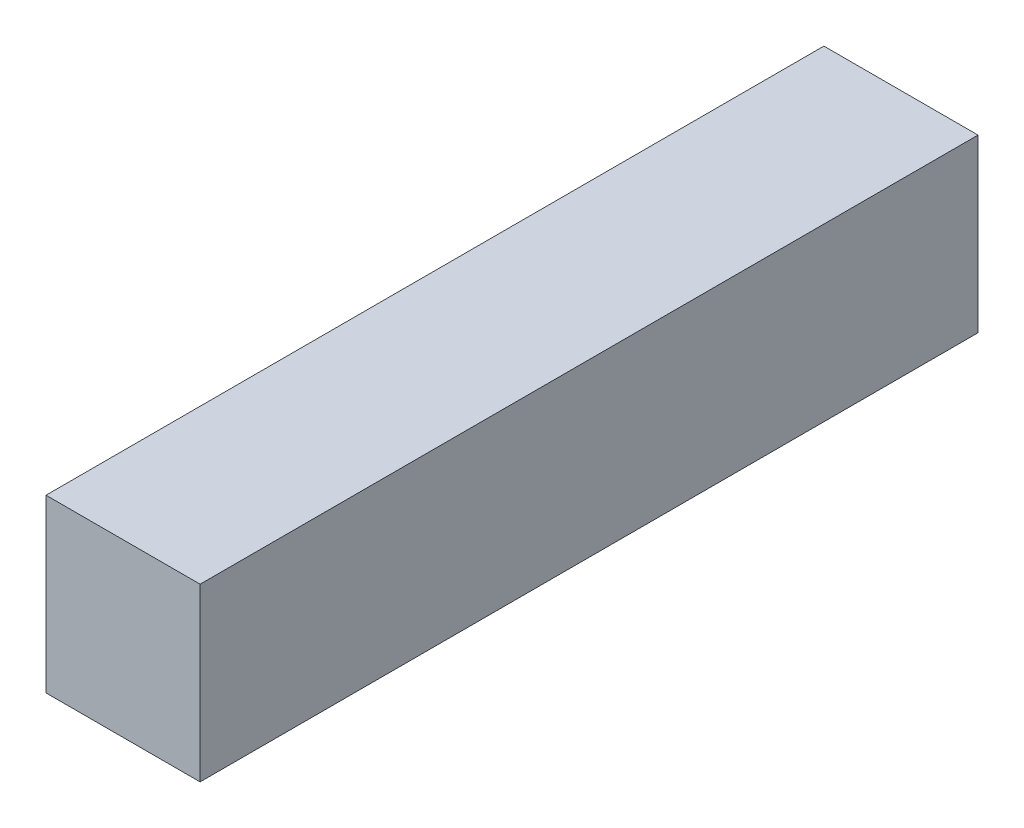
ISO-10303-21;
HEADER;
FILE_DESCRIPTION(('STEP AP214'),'2;1');
FILE_NAME('part.step','',(''),(''),'','','');
FILE_SCHEMA(('AUTOMOTIVE_DESIGN { 1 0 10303 214 1 1 1 1 }'));
ENDSEC;
DATA;
#1=APPLICATION_CONTEXT('core data for automotive mechanical design processes');
#2=APPLICATION_PROTOCOL_DEFINITION('international standard','automotive_design',2000,#1);
#3=PRODUCT_CONTEXT('',#1,'mechanical');
#4=PRODUCT('Part','Part','',(#3));
#5=PRODUCT_RELATED_PRODUCT_CATEGORY('part','',(#4));
#6=PRODUCT_DEFINITION_FORMATION('','',#4);
#7=PRODUCT_DEFINITION_CONTEXT('part definition',#1,'design');
#8=PRODUCT_DEFINITION('design','',#6,#7);
#9=PRODUCT_DEFINITION_SHAPE('','',#8);
#10=(LENGTH_UNIT() NAMED_UNIT(*) SI_UNIT(.MILLI.,.METRE.));
#11=(NAMED_UNIT(*) PLANE_ANGLE_UNIT() SI_UNIT($,.RADIAN.));
#12=(NAMED_UNIT(*) SI_UNIT($,.STERADIAN.) SOLID_ANGLE_UNIT());
#13=UNCERTAINTY_MEASURE_WITH_UNIT(LENGTH_MEASURE(1.E-05),#10,'distance_accuracy_value','');
#14=(GEOMETRIC_REPRESENTATION_CONTEXT(3) GLOBAL_UNCERTAINTY_ASSIGNED_CONTEXT((#13)) GLOBAL_UNIT_ASSIGNED_CONTEXT((#10,
#11,#12)) REPRESENTATION_CONTEXT('',''));
#15=CARTESIAN_POINT('',(0.,0.,0.));
#16=DIRECTION('',(0.,0.,1.));
#17=DIRECTION('',(1.,0.,0.));
#18=AXIS2_PLACEMENT_3D('',#15,#16,#17);
#19=CARTESIAN_POINT('',(0.,0.,318.));
#20=DIRECTION('',(-1.,0.,0.));
#21=DIRECTION('',(0.,0.,1.));
#22=AXIS2_PLACEMENT_3D('',#19,#20,#21);
#23=PLANE('',#22);
#24=DIRECTION('',(0.,1.,0.));
#25=VECTOR('',#24,1.);
#26=CARTESIAN_POINT('',(0.,0.,0.));
#27=LINE('',#26,#25);
#28=CARTESIAN_POINT('',(0.,0.,0.));
#29=VERTEX_POINT('',#28);
#30=CARTESIAN_POINT('',(0.,70.,0.));
#31=VERTEX_POINT('',#30);
#32=EDGE_CURVE('E96',#29,#31,#27,.T.);
#33=ORIENTED_EDGE('',*,*,#32,.T.);
#34=DIRECTION('',(0.,0.,-1.));
#35=VECTOR('',#34,1.);
#36=CARTESIAN_POINT('',(0.,70.,318.));
#37=LINE('',#36,#35);
#38=CARTESIAN_POINT('',(0.,70.,318.));
#39=VERTEX_POINT('',#38);
#40=EDGE_CURVE('E11',#39,#31,#37,.T.);
#41=ORIENTED_EDGE('',*,*,#40,.F.);
#42=DIRECTION('',(0.,1.,0.));
#43=VECTOR('',#42,1.);
#44=CARTESIAN_POINT('',(0.,0.,318.));
#45=LINE('',#44,#43);
#46=CARTESIAN_POINT('',(0.,0.,318.));
#47=VERTEX_POINT('',#46);
#48=EDGE_CURVE('E84',#47,#39,#45,.T.);
#49=ORIENTED_EDGE('',*,*,#48,.F.);
#50=DIRECTION('',(0.,0.,-1.));
#51=VECTOR('',#50,1.);
#52=CARTESIAN_POINT('',(0.,0.,318.));
#53=LINE('',#52,#51);
#54=EDGE_CURVE('E92',#47,#29,#53,.T.);
#55=ORIENTED_EDGE('',*,*,#54,.T.);
#56=EDGE_LOOP('',(#33,#41,#49,#55));
#57=FACE_BOUND('',#56,.T.);
#58=ADVANCED_FACE('F33',(#57),#23,.F.);
#59=CARTESIAN_POINT('',(0.,70.,318.));
#60=DIRECTION('',(0.,-1.,0.));
#61=DIRECTION('',(1.,0.,0.));
#62=AXIS2_PLACEMENT_3D('',#59,#60,#61);
#63=PLANE('',#62);
#64=DIRECTION('',(-1.,0.,0.));
#65=VECTOR('',#64,1.);
#66=CARTESIAN_POINT('',(0.,70.,0.));
#67=LINE('',#66,#65);
#68=CARTESIAN_POINT('',(-63.,70.,0.));
#69=VERTEX_POINT('',#68);
#70=EDGE_CURVE('E88',#31,#69,#67,.T.);
#71=ORIENTED_EDGE('',*,*,#70,.T.);
#72=DIRECTION('',(0.,0.,-1.));
#73=VECTOR('',#72,1.);
#74=CARTESIAN_POINT('',(-63.,70.,318.));
#75=LINE('',#74,#73);
#76=CARTESIAN_POINT('',(-63.,70.,318.));
#77=VERTEX_POINT('',#76);
#78=EDGE_CURVE('E41',#77,#69,#75,.T.);
#79=ORIENTED_EDGE('',*,*,#78,.F.);
#80=DIRECTION('',(-1.,0.,0.));
#81=VECTOR('',#80,1.);
#82=CARTESIAN_POINT('',(0.,70.,318.));
#83=LINE('',#82,#81);
#84=EDGE_CURVE('E79',#39,#77,#83,.T.);
#85=ORIENTED_EDGE('',*,*,#84,.F.);
#86=ORIENTED_EDGE('',*,*,#40,.T.);
#87=EDGE_LOOP('',(#71,#79,#85,#86));
#88=FACE_BOUND('',#87,.T.);
#89=ADVANCED_FACE('F87',(#88),#63,.F.);
#90=CARTESIAN_POINT('',(-63.,0.,318.));
#91=DIRECTION('',(1.,0.,0.));
#92=DIRECTION('',(0.,0.,-1.));
#93=AXIS2_PLACEMENT_3D('',#90,#91,#92);
#94=PLANE('',#93);
#95=DIRECTION('',(0.,-1.,0.));
#96=VECTOR('',#95,1.);
#97=CARTESIAN_POINT('',(-63.,0.,0.));
#98=LINE('',#97,#96);
#99=CARTESIAN_POINT('',(-63.,0.,0.));
#100=VERTEX_POINT('',#99);
#101=EDGE_CURVE('E66',#69,#100,#98,.T.);
#102=ORIENTED_EDGE('',*,*,#101,.T.);
#103=DIRECTION('',(0.,0.,-1.));
#104=VECTOR('',#103,1.);
#105=CARTESIAN_POINT('',(-63.,0.,318.));
#106=LINE('',#105,#104);
#107=CARTESIAN_POINT('',(-63.,0.,318.));
#108=VERTEX_POINT('',#107);
#109=EDGE_CURVE('E89',#108,#100,#106,.T.);
#110=ORIENTED_EDGE('',*,*,#109,.F.);
#111=DIRECTION('',(0.,-1.,0.));
#112=VECTOR('',#111,1.);
#113=CARTESIAN_POINT('',(-63.,0.,318.));
#114=LINE('',#113,#112);
#115=EDGE_CURVE('E82',#77,#108,#114,.T.);
#116=ORIENTED_EDGE('',*,*,#115,.F.);
#117=ORIENTED_EDGE('',*,*,#78,.T.);
#118=EDGE_LOOP('',(#102,#110,#116,#117));
#119=FACE_BOUND('',#118,.T.);
#120=ADVANCED_FACE('F90',(#119),#94,.F.);
#121=CARTESIAN_POINT('',(0.,0.,318.));
#122=DIRECTION('',(0.,1.,0.));
#123=DIRECTION('',(-1.,0.,0.));
#124=AXIS2_PLACEMENT_3D('',#121,#122,#123);
#125=PLANE('',#124);
#126=DIRECTION('',(1.,0.,0.));
#127=VECTOR('',#126,1.);
#128=CARTESIAN_POINT('',(0.,0.,0.));
#129=LINE('',#128,#127);
#130=EDGE_CURVE('E72',#100,#29,#129,.T.);
#131=ORIENTED_EDGE('',*,*,#130,.T.);
#132=ORIENTED_EDGE('',*,*,#54,.F.);
#133=DIRECTION('',(1.,0.,0.));
#134=VECTOR('',#133,1.);
#135=CARTESIAN_POINT('',(0.,0.,318.));
#136=LINE('',#135,#134);
#137=EDGE_CURVE('E49',#108,#47,#136,.T.);
#138=ORIENTED_EDGE('',*,*,#137,.F.);
#139=ORIENTED_EDGE('',*,*,#109,.T.);
#140=EDGE_LOOP('',(#131,#132,#138,#139));
#141=FACE_BOUND('',#140,.T.);
#142=ADVANCED_FACE('F103',(#141),#125,.F.);
#143=CARTESIAN_POINT('',(0.,0.,318.));
#144=DIRECTION('',(0.,0.,1.));
#145=DIRECTION('',(1.,0.,0.));
#146=AXIS2_PLACEMENT_3D('',#143,#144,#145);
#147=PLANE('',#146);
#148=ORIENTED_EDGE('',*,*,#48,.T.);
#149=ORIENTED_EDGE('',*,*,#84,.T.);
#150=ORIENTED_EDGE('',*,*,#115,.T.);
#151=ORIENTED_EDGE('',*,*,#137,.T.);
#152=EDGE_LOOP('',(#148,#149,#150,#151));
#153=FACE_BOUND('',#152,.T.);
#154=ADVANCED_FACE('F80',(#153),#147,.T.);
#155=CARTESIAN_POINT('',(0.,0.,0.));
#156=DIRECTION('',(0.,0.,1.));
#157=DIRECTION('',(1.,0.,0.));
#158=AXIS2_PLACEMENT_3D('',#155,#156,#157);
#159=PLANE('',#158);
#160=ORIENTED_EDGE('',*,*,#32,.F.);
#161=ORIENTED_EDGE('',*,*,#130,.F.);
#162=ORIENTED_EDGE('',*,*,#101,.F.);
#163=ORIENTED_EDGE('',*,*,#70,.F.);
#164=EDGE_LOOP('',(#160,#161,#162,#163));
#165=FACE_BOUND('',#164,.T.);
#166=ADVANCED_FACE('F106',(#165),#159,.F.);
#167=CLOSED_SHELL('',(#58,#89,#120,#142,#154,#166));
#168=MANIFOLD_SOLID_BREP('B2',#167);
#169=ADVANCED_BREP_SHAPE_REPRESENTATION('',(#18,#168),#14);
#170=SHAPE_DEFINITION_REPRESENTATION(#9,#169);
ENDSEC;
END-ISO-10303-21;
